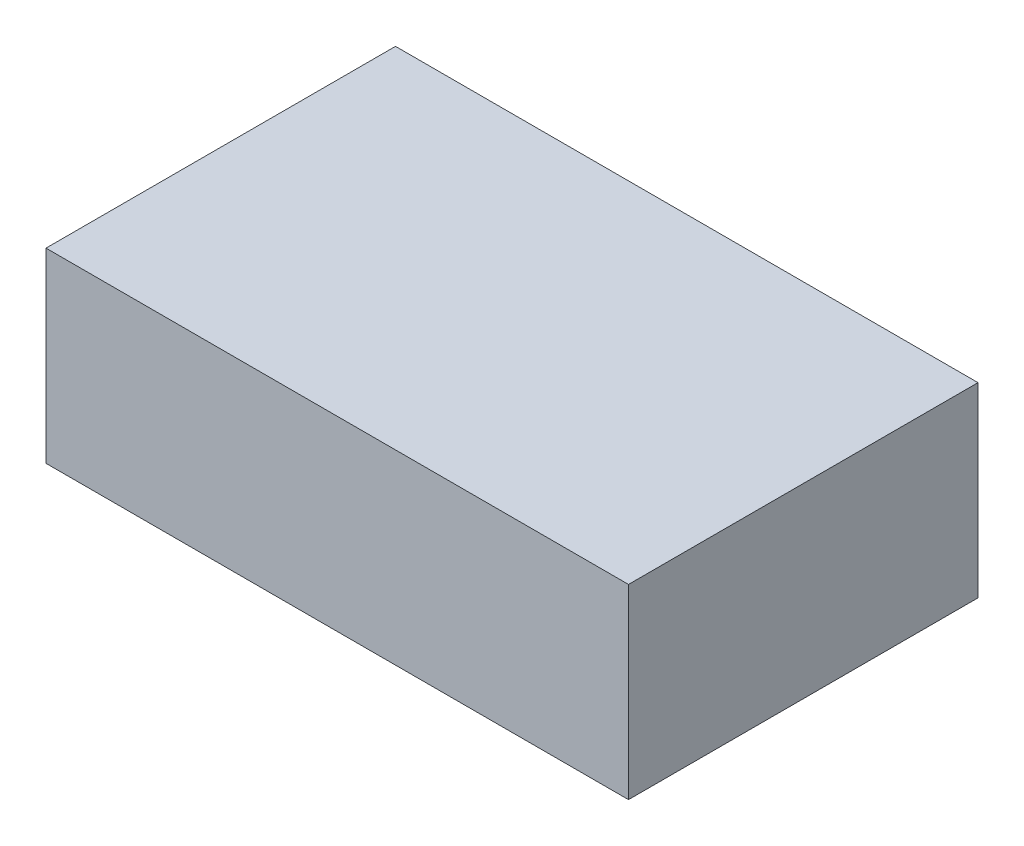
ISO-10303-21;
HEADER;
FILE_DESCRIPTION(('STEP AP214'),'2;1');
FILE_NAME('part.step','',(''),(''),'','','');
FILE_SCHEMA(('AUTOMOTIVE_DESIGN { 1 0 10303 214 1 1 1 1 }'));
ENDSEC;
DATA;
#1=APPLICATION_CONTEXT('core data for automotive mechanical design processes');
#2=APPLICATION_PROTOCOL_DEFINITION('international standard','automotive_design',2000,#1);
#3=PRODUCT_CONTEXT('',#1,'mechanical');
#4=PRODUCT('Part','Part','',(#3));
#5=PRODUCT_RELATED_PRODUCT_CATEGORY('part','',(#4));
#6=PRODUCT_DEFINITION_FORMATION('','',#4);
#7=PRODUCT_DEFINITION_CONTEXT('part definition',#1,'design');
#8=PRODUCT_DEFINITION('design','',#6,#7);
#9=PRODUCT_DEFINITION_SHAPE('','',#8);
#10=(LENGTH_UNIT() NAMED_UNIT(*) SI_UNIT(.MILLI.,.METRE.));
#11=(NAMED_UNIT(*) PLANE_ANGLE_UNIT() SI_UNIT($,.RADIAN.));
#12=(NAMED_UNIT(*) SI_UNIT($,.STERADIAN.) SOLID_ANGLE_UNIT());
#13=UNCERTAINTY_MEASURE_WITH_UNIT(LENGTH_MEASURE(1.E-05),#10,'distance_accuracy_value','');
#14=(GEOMETRIC_REPRESENTATION_CONTEXT(3) GLOBAL_UNCERTAINTY_ASSIGNED_CONTEXT((#13)) GLOBAL_UNIT_ASSIGNED_CONTEXT((#10,
#11,#12)) REPRESENTATION_CONTEXT('',''));
#15=CARTESIAN_POINT('',(0.,0.,0.));
#16=DIRECTION('',(0.,0.,1.));
#17=DIRECTION('',(1.,0.,0.));
#18=AXIS2_PLACEMENT_3D('',#15,#16,#17);
#19=CARTESIAN_POINT('',(-9.57479878820766,2.19072164948453,15.));
#20=DIRECTION('',(1.,0.,0.));
#21=DIRECTION('',(0.,0.,-1.));
#22=AXIS2_PLACEMENT_3D('',#19,#20,#21);
#23=PLANE('',#22);
#24=DIRECTION('',(0.,-1.,0.));
#25=VECTOR('',#24,1.);
#26=CARTESIAN_POINT('',(-9.57479878820766,2.19072164948453,0.));
#27=LINE('',#26,#25);
#28=CARTESIAN_POINT('',(-9.57479878820766,2.19072164948453,0.));
#29=VERTEX_POINT('',#28);
#30=CARTESIAN_POINT('',(-9.57479878820766,-5.80927835051547,0.));
#31=VERTEX_POINT('',#30);
#32=EDGE_CURVE('E101',#29,#31,#27,.T.);
#33=ORIENTED_EDGE('',*,*,#32,.T.);
#34=DIRECTION('',(0.,0.,-1.));
#35=VECTOR('',#34,1.);
#36=CARTESIAN_POINT('',(-9.57479878820766,-5.80927835051547,15.));
#37=LINE('',#36,#35);
#38=CARTESIAN_POINT('',(-9.57479878820766,-5.80927835051547,15.));
#39=VERTEX_POINT('',#38);
#40=EDGE_CURVE('E11',#39,#31,#37,.T.);
#41=ORIENTED_EDGE('',*,*,#40,.F.);
#42=DIRECTION('',(0.,-1.,0.));
#43=VECTOR('',#42,1.);
#44=CARTESIAN_POINT('',(-9.57479878820766,2.19072164948453,15.));
#45=LINE('',#44,#43);
#46=CARTESIAN_POINT('',(-9.57479878820766,2.19072164948453,15.));
#47=VERTEX_POINT('',#46);
#48=EDGE_CURVE('E89',#47,#39,#45,.T.);
#49=ORIENTED_EDGE('',*,*,#48,.F.);
#50=DIRECTION('',(0.,0.,-1.));
#51=VECTOR('',#50,1.);
#52=CARTESIAN_POINT('',(-9.57479878820766,2.19072164948453,15.));
#53=LINE('',#52,#51);
#54=EDGE_CURVE('E97',#47,#29,#53,.T.);
#55=ORIENTED_EDGE('',*,*,#54,.T.);
#56=EDGE_LOOP('',(#33,#41,#49,#55));
#57=FACE_BOUND('',#56,.T.);
#58=ADVANCED_FACE('F38',(#57),#23,.F.);
#59=CARTESIAN_POINT('',(-9.57479878820766,-5.80927835051547,15.));
#60=DIRECTION('',(0.,1.,0.));
#61=DIRECTION('',(0.,0.,1.));
#62=AXIS2_PLACEMENT_3D('',#59,#60,#61);
#63=PLANE('',#62);
#64=DIRECTION('',(1.,0.,0.));
#65=VECTOR('',#64,1.);
#66=CARTESIAN_POINT('',(-9.57479878820766,-5.80927835051547,0.));
#67=LINE('',#66,#65);
#68=CARTESIAN_POINT('',(15.4252012117923,-5.80927835051547,0.));
#69=VERTEX_POINT('',#68);
#70=EDGE_CURVE('E93',#31,#69,#67,.T.);
#71=ORIENTED_EDGE('',*,*,#70,.T.);
#72=DIRECTION('',(0.,0.,-1.));
#73=VECTOR('',#72,1.);
#74=CARTESIAN_POINT('',(15.4252012117923,-5.80927835051547,15.));
#75=LINE('',#74,#73);
#76=CARTESIAN_POINT('',(15.4252012117923,-5.80927835051547,15.));
#77=VERTEX_POINT('',#76);
#78=EDGE_CURVE('E46',#77,#69,#75,.T.);
#79=ORIENTED_EDGE('',*,*,#78,.F.);
#80=DIRECTION('',(1.,0.,0.));
#81=VECTOR('',#80,1.);
#82=CARTESIAN_POINT('',(-9.57479878820766,-5.80927835051547,15.));
#83=LINE('',#82,#81);
#84=EDGE_CURVE('E84',#39,#77,#83,.T.);
#85=ORIENTED_EDGE('',*,*,#84,.F.);
#86=ORIENTED_EDGE('',*,*,#40,.T.);
#87=EDGE_LOOP('',(#71,#79,#85,#86));
#88=FACE_BOUND('',#87,.T.);
#89=ADVANCED_FACE('F92',(#88),#63,.F.);
#90=CARTESIAN_POINT('',(15.4252012117923,2.19072164948453,15.));
#91=DIRECTION('',(-1.,0.,0.));
#92=DIRECTION('',(0.,-1.,0.));
#93=AXIS2_PLACEMENT_3D('',#90,#91,#92);
#94=PLANE('',#93);
#95=DIRECTION('',(0.,1.,0.));
#96=VECTOR('',#95,1.);
#97=CARTESIAN_POINT('',(15.4252012117923,2.19072164948453,0.));
#98=LINE('',#97,#96);
#99=CARTESIAN_POINT('',(15.4252012117923,2.19072164948453,0.));
#100=VERTEX_POINT('',#99);
#101=EDGE_CURVE('E71',#69,#100,#98,.T.);
#102=ORIENTED_EDGE('',*,*,#101,.T.);
#103=DIRECTION('',(0.,0.,-1.));
#104=VECTOR('',#103,1.);
#105=CARTESIAN_POINT('',(15.4252012117923,2.19072164948453,15.));
#106=LINE('',#105,#104);
#107=CARTESIAN_POINT('',(15.4252012117923,2.19072164948453,15.));
#108=VERTEX_POINT('',#107);
#109=EDGE_CURVE('E94',#108,#100,#106,.T.);
#110=ORIENTED_EDGE('',*,*,#109,.F.);
#111=DIRECTION('',(0.,1.,0.));
#112=VECTOR('',#111,1.);
#113=CARTESIAN_POINT('',(15.4252012117923,2.19072164948453,15.));
#114=LINE('',#113,#112);
#115=EDGE_CURVE('E87',#77,#108,#114,.T.);
#116=ORIENTED_EDGE('',*,*,#115,.F.);
#117=ORIENTED_EDGE('',*,*,#78,.T.);
#118=EDGE_LOOP('',(#102,#110,#116,#117));
#119=FACE_BOUND('',#118,.T.);
#120=ADVANCED_FACE('F95',(#119),#94,.F.);
#121=CARTESIAN_POINT('',(-9.57479878820766,2.19072164948453,15.));
#122=DIRECTION('',(0.,-1.,0.));
#123=DIRECTION('',(0.,0.,-1.));
#124=AXIS2_PLACEMENT_3D('',#121,#122,#123);
#125=PLANE('',#124);
#126=DIRECTION('',(-1.,0.,0.));
#127=VECTOR('',#126,1.);
#128=CARTESIAN_POINT('',(-9.57479878820766,2.19072164948453,0.));
#129=LINE('',#128,#127);
#130=EDGE_CURVE('E77',#100,#29,#129,.T.);
#131=ORIENTED_EDGE('',*,*,#130,.T.);
#132=ORIENTED_EDGE('',*,*,#54,.F.);
#133=DIRECTION('',(-1.,0.,0.));
#134=VECTOR('',#133,1.);
#135=CARTESIAN_POINT('',(-9.57479878820766,2.19072164948453,15.));
#136=LINE('',#135,#134);
#137=EDGE_CURVE('E54',#108,#47,#136,.T.);
#138=ORIENTED_EDGE('',*,*,#137,.F.);
#139=ORIENTED_EDGE('',*,*,#109,.T.);
#140=EDGE_LOOP('',(#131,#132,#138,#139));
#141=FACE_BOUND('',#140,.T.);
#142=ADVANCED_FACE('F108',(#141),#125,.F.);
#143=CARTESIAN_POINT('',(0.,0.,15.));
#144=DIRECTION('',(0.,0.,1.));
#145=DIRECTION('',(1.,0.,0.));
#146=AXIS2_PLACEMENT_3D('',#143,#144,#145);
#147=PLANE('',#146);
#148=ORIENTED_EDGE('',*,*,#48,.T.);
#149=ORIENTED_EDGE('',*,*,#84,.T.);
#150=ORIENTED_EDGE('',*,*,#115,.T.);
#151=ORIENTED_EDGE('',*,*,#137,.T.);
#152=EDGE_LOOP('',(#148,#149,#150,#151));
#153=FACE_BOUND('',#152,.T.);
#154=ADVANCED_FACE('F85',(#153),#147,.T.);
#155=CARTESIAN_POINT('',(0.,0.,0.));
#156=DIRECTION('',(0.,0.,1.));
#157=DIRECTION('',(1.,0.,0.));
#158=AXIS2_PLACEMENT_3D('',#155,#156,#157);
#159=PLANE('',#158);
#160=ORIENTED_EDGE('',*,*,#32,.F.);
#161=ORIENTED_EDGE('',*,*,#130,.F.);
#162=ORIENTED_EDGE('',*,*,#101,.F.);
#163=ORIENTED_EDGE('',*,*,#70,.F.);
#164=EDGE_LOOP('',(#160,#161,#162,#163));
#165=FACE_BOUND('',#164,.T.);
#166=ADVANCED_FACE('F111',(#165),#159,.F.);
#167=CLOSED_SHELL('',(#58,#89,#120,#142,#154,#166));
#168=MANIFOLD_SOLID_BREP('B2',#167);
#169=ADVANCED_BREP_SHAPE_REPRESENTATION('',(#18,#168),#14);
#170=SHAPE_DEFINITION_REPRESENTATION(#9,#169);
ENDSEC;
END-ISO-10303-21;
